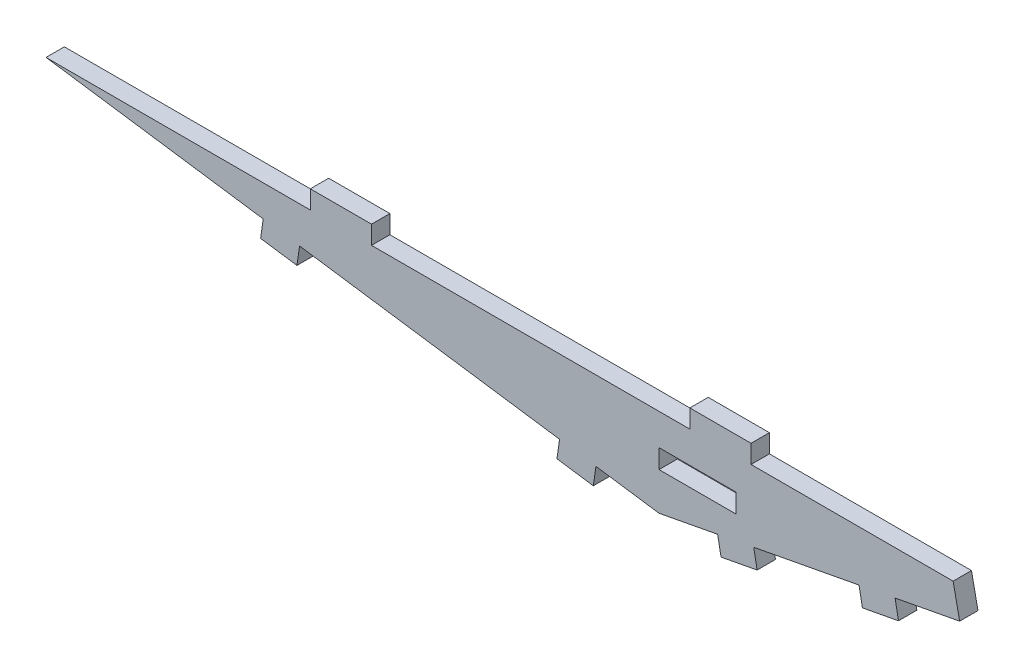
ISO-10303-21;
HEADER;
FILE_DESCRIPTION(('STEP AP214'),'2;1');
FILE_NAME('part.step','',(''),(''),'','','');
FILE_SCHEMA(('AUTOMOTIVE_DESIGN { 1 0 10303 214 1 1 1 1 }'));
ENDSEC;
DATA;
#1=APPLICATION_CONTEXT('core data for automotive mechanical design processes');
#2=APPLICATION_PROTOCOL_DEFINITION('international standard','automotive_design',2000,#1);
#3=PRODUCT_CONTEXT('',#1,'mechanical');
#4=PRODUCT('Part','Part','',(#3));
#5=PRODUCT_RELATED_PRODUCT_CATEGORY('part','',(#4));
#6=PRODUCT_DEFINITION_FORMATION('','',#4);
#7=PRODUCT_DEFINITION_CONTEXT('part definition',#1,'design');
#8=PRODUCT_DEFINITION('design','',#6,#7);
#9=PRODUCT_DEFINITION_SHAPE('','',#8);
#10=(LENGTH_UNIT() NAMED_UNIT(*) SI_UNIT(.MILLI.,.METRE.));
#11=(NAMED_UNIT(*) PLANE_ANGLE_UNIT() SI_UNIT($,.RADIAN.));
#12=(NAMED_UNIT(*) SI_UNIT($,.STERADIAN.) SOLID_ANGLE_UNIT());
#13=UNCERTAINTY_MEASURE_WITH_UNIT(LENGTH_MEASURE(1.E-05),#10,'distance_accuracy_value','');
#14=(GEOMETRIC_REPRESENTATION_CONTEXT(3) GLOBAL_UNCERTAINTY_ASSIGNED_CONTEXT((#13)) GLOBAL_UNIT_ASSIGNED_CONTEXT((#10,
#11,#12)) REPRESENTATION_CONTEXT('',''));
#15=CARTESIAN_POINT('',(0.,0.,0.));
#16=DIRECTION('',(0.,0.,1.));
#17=DIRECTION('',(1.,0.,0.));
#18=AXIS2_PLACEMENT_3D('',#15,#16,#17);
#19=CARTESIAN_POINT('',(-23.403233798281,-4.13319801123004,-1.524));
#20=DIRECTION('',(0.979200968562608,0.202892738081111,0.));
#21=DIRECTION('',(-0.202892738081111,0.979200968562608,0.));
#22=AXIS2_PLACEMENT_3D('',#19,#20,#21);
#23=PLANE('',#22);
#24=DIRECTION('',(-0.202892738081111,0.979200968562608,0.));
#25=VECTOR('',#24,1.);
#26=CARTESIAN_POINT('',(-23.403233798281,-4.13319801123004,0.));
#27=LINE('',#26,#25);
#28=CARTESIAN_POINT('',(-23.403233798281,-4.13319801123004,0.));
#29=VERTEX_POINT('',#28);
#30=CARTESIAN_POINT('',(-23.9438657478912,-1.52400000000021,0.));
#31=VERTEX_POINT('',#30);
#32=EDGE_CURVE('E278',#29,#31,#27,.T.);
#33=ORIENTED_EDGE('',*,*,#32,.F.);
#34=DIRECTION('',(0.,0.,1.));
#35=VECTOR('',#34,1.);
#36=CARTESIAN_POINT('',(-23.403233798281,-4.13319801123004,-1.524));
#37=LINE('',#36,#35);
#38=CARTESIAN_POINT('',(-23.403233798281,-4.13319801123004,-1.524));
#39=VERTEX_POINT('',#38);
#40=EDGE_CURVE('E11',#39,#29,#37,.T.);
#41=ORIENTED_EDGE('',*,*,#40,.F.);
#42=DIRECTION('',(-0.202892738081111,0.979200968562608,0.));
#43=VECTOR('',#42,1.);
#44=CARTESIAN_POINT('',(-23.403233798281,-4.13319801123004,-1.524));
#45=LINE('',#44,#43);
#46=CARTESIAN_POINT('',(-23.9438657478912,-1.52400000000021,-1.524));
#47=VERTEX_POINT('',#46);
#48=EDGE_CURVE('E282',#39,#47,#45,.T.);
#49=ORIENTED_EDGE('',*,*,#48,.T.);
#50=DIRECTION('',(0.,0.,1.));
#51=VECTOR('',#50,1.);
#52=CARTESIAN_POINT('',(-23.9438657478912,-1.52400000000021,-1.524));
#53=LINE('',#52,#51);
#54=EDGE_CURVE('E39',#47,#31,#53,.T.);
#55=ORIENTED_EDGE('',*,*,#54,.T.);
#56=EDGE_LOOP('',(#33,#41,#49,#55));
#57=FACE_BOUND('',#56,.T.);
#58=ADVANCED_FACE('F36',(#57),#23,.T.);
#59=CARTESIAN_POINT('',(-23.403233798281,-4.13319801123004,-1.524));
#60=DIRECTION('',(0.185772423247239,-0.982592798040393,0.));
#61=DIRECTION('',(0.982592798040393,0.185772423247239,0.));
#62=AXIS2_PLACEMENT_3D('',#59,#60,#61);
#63=PLANE('',#62);
#64=DIRECTION('',(0.982592798040393,0.185772423247239,0.));
#65=VECTOR('',#64,1.);
#66=CARTESIAN_POINT('',(-23.403233798281,-4.13319801123004,0.));
#67=LINE('',#66,#65);
#68=CARTESIAN_POINT('',(-28.7616153644906,-5.14627232871265,0.));
#69=VERTEX_POINT('',#68);
#70=EDGE_CURVE('E286',#69,#29,#67,.T.);
#71=ORIENTED_EDGE('',*,*,#70,.F.);
#72=DIRECTION('',(0.,0.,1.));
#73=VECTOR('',#72,1.);
#74=CARTESIAN_POINT('',(-28.7616153644906,-5.14627232871265,-1.524));
#75=LINE('',#74,#73);
#76=CARTESIAN_POINT('',(-28.7616153644906,-5.14627232871265,-1.524));
#77=VERTEX_POINT('',#76);
#78=EDGE_CURVE('E44',#77,#69,#75,.T.);
#79=ORIENTED_EDGE('',*,*,#78,.F.);
#80=DIRECTION('',(0.982592798040393,0.185772423247239,0.));
#81=VECTOR('',#80,1.);
#82=CARTESIAN_POINT('',(-23.403233798281,-4.13319801123004,-1.524));
#83=LINE('',#82,#81);
#84=EDGE_CURVE('E364',#77,#39,#83,.T.);
#85=ORIENTED_EDGE('',*,*,#84,.T.);
#86=ORIENTED_EDGE('',*,*,#40,.T.);
#87=EDGE_LOOP('',(#71,#79,#85,#86));
#88=FACE_BOUND('',#87,.T.);
#89=ADVANCED_FACE('F511',(#88),#63,.T.);
#90=CARTESIAN_POINT('',(-28.7616153644906,-5.14627232871265,-1.524));
#91=DIRECTION('',(0.982592798040394,0.185772423247235,0.));
#92=DIRECTION('',(-0.185772423247235,0.982592798040394,0.));
#93=AXIS2_PLACEMENT_3D('',#90,#91,#92);
#94=PLANE('',#93);
#95=DIRECTION('',(-0.185772423247235,0.982592798040394,0.));
#96=VECTOR('',#95,1.);
#97=CARTESIAN_POINT('',(-28.7616153644906,-5.14627232871265,0.));
#98=LINE('',#97,#96);
#99=CARTESIAN_POINT('',(-28.4784981914618,-6.64374375292641,0.));
#100=VERTEX_POINT('',#99);
#101=EDGE_CURVE('E444',#100,#69,#98,.T.);
#102=ORIENTED_EDGE('',*,*,#101,.F.);
#103=DIRECTION('',(0.,0.,1.));
#104=VECTOR('',#103,1.);
#105=CARTESIAN_POINT('',(-28.4784981914618,-6.64374375292641,-1.524));
#106=LINE('',#105,#104);
#107=CARTESIAN_POINT('',(-28.4784981914618,-6.64374375292641,-1.524));
#108=VERTEX_POINT('',#107);
#109=EDGE_CURVE('E450',#108,#100,#106,.T.);
#110=ORIENTED_EDGE('',*,*,#109,.F.);
#111=DIRECTION('',(-0.185772423247235,0.982592798040394,0.));
#112=VECTOR('',#111,1.);
#113=CARTESIAN_POINT('',(-28.7616153644906,-5.14627232871265,-1.524));
#114=LINE('',#113,#112);
#115=EDGE_CURVE('E361',#108,#77,#114,.T.);
#116=ORIENTED_EDGE('',*,*,#115,.T.);
#117=ORIENTED_EDGE('',*,*,#78,.T.);
#118=EDGE_LOOP('',(#102,#110,#116,#117));
#119=FACE_BOUND('',#118,.T.);
#120=ADVANCED_FACE('F610',(#119),#94,.T.);
#121=CARTESIAN_POINT('',(-31.4734410398889,-7.20997809898394,-1.524));
#122=DIRECTION('',(0.185772423247223,-0.982592798040396,0.));
#123=DIRECTION('',(0.982592798040396,0.185772423247223,0.));
#124=AXIS2_PLACEMENT_3D('',#121,#122,#123);
#125=PLANE('',#124);
#126=DIRECTION('',(0.982592798040396,0.185772423247223,0.));
#127=VECTOR('',#126,1.);
#128=CARTESIAN_POINT('',(-31.4734410398889,-7.20997809898394,0.));
#129=LINE('',#128,#127);
#130=CARTESIAN_POINT('',(-31.4734410398889,-7.20997809898394,0.));
#131=VERTEX_POINT('',#130);
#132=EDGE_CURVE('E441',#131,#100,#129,.T.);
#133=ORIENTED_EDGE('',*,*,#132,.F.);
#134=DIRECTION('',(0.,0.,1.));
#135=VECTOR('',#134,1.);
#136=CARTESIAN_POINT('',(-31.4734410398889,-7.20997809898394,-1.524));
#137=LINE('',#136,#135);
#138=CARTESIAN_POINT('',(-31.4734410398889,-7.20997809898394,-1.524));
#139=VERTEX_POINT('',#138);
#140=EDGE_CURVE('E452',#139,#131,#137,.T.);
#141=ORIENTED_EDGE('',*,*,#140,.F.);
#142=DIRECTION('',(0.982592798040396,0.185772423247223,0.));
#143=VECTOR('',#142,1.);
#144=CARTESIAN_POINT('',(-31.4734410398889,-7.20997809898394,-1.524));
#145=LINE('',#144,#143);
#146=EDGE_CURVE('E358',#139,#108,#145,.T.);
#147=ORIENTED_EDGE('',*,*,#146,.T.);
#148=ORIENTED_EDGE('',*,*,#109,.T.);
#149=EDGE_LOOP('',(#133,#141,#147,#148));
#150=FACE_BOUND('',#149,.T.);
#151=ADVANCED_FACE('F608',(#150),#125,.T.);
#152=CARTESIAN_POINT('',(-31.7565582129177,-5.71250667477038,-1.524));
#153=DIRECTION('',(-0.982592798040396,-0.185772423247221,0.));
#154=DIRECTION('',(0.185772423247221,-0.982592798040396,0.));
#155=AXIS2_PLACEMENT_3D('',#152,#153,#154);
#156=PLANE('',#155);
#157=DIRECTION('',(0.185772423247221,-0.982592798040397,0.));
#158=VECTOR('',#157,1.);
#159=CARTESIAN_POINT('',(-31.7565582129177,-5.71250667477038,0.));
#160=LINE('',#159,#158);
#161=CARTESIAN_POINT('',(-31.7565582129177,-5.71250667477038,0.));
#162=VERTEX_POINT('',#161);
#163=EDGE_CURVE('E438',#162,#131,#160,.T.);
#164=ORIENTED_EDGE('',*,*,#163,.F.);
#165=DIRECTION('',(0.,0.,1.));
#166=VECTOR('',#165,1.);
#167=CARTESIAN_POINT('',(-31.7565582129177,-5.71250667477038,-1.524));
#168=LINE('',#167,#166);
#169=CARTESIAN_POINT('',(-31.7565582129177,-5.71250667477038,-1.524));
#170=VERTEX_POINT('',#169);
#171=EDGE_CURVE('E454',#170,#162,#168,.T.);
#172=ORIENTED_EDGE('',*,*,#171,.F.);
#173=DIRECTION('',(0.185772423247221,-0.982592798040397,0.));
#174=VECTOR('',#173,1.);
#175=CARTESIAN_POINT('',(-31.7565582129177,-5.71250667477038,-1.524));
#176=LINE('',#175,#174);
#177=EDGE_CURVE('E355',#170,#139,#176,.T.);
#178=ORIENTED_EDGE('',*,*,#177,.T.);
#179=ORIENTED_EDGE('',*,*,#140,.T.);
#180=EDGE_LOOP('',(#164,#172,#178,#179));
#181=FACE_BOUND('',#180,.T.);
#182=ADVANCED_FACE('F604',(#181),#156,.T.);
#183=CARTESIAN_POINT('',(-31.7565582129177,-5.71250667477038,-1.524));
#184=DIRECTION('',(0.185772423247224,-0.982592798040396,0.));
#185=DIRECTION('',(0.982592798040396,0.185772423247224,0.));
#186=AXIS2_PLACEMENT_3D('',#183,#184,#185);
#187=PLANE('',#186);
#188=DIRECTION('',(0.982592798040396,0.185772423247224,0.));
#189=VECTOR('',#188,1.);
#190=CARTESIAN_POINT('',(-31.7565582129177,-5.71250667477038,0.));
#191=LINE('',#190,#189);
#192=CARTESIAN_POINT('',(-40.4952942076748,-7.36468259657784,0.));
#193=VERTEX_POINT('',#192);
#194=EDGE_CURVE('E435',#193,#162,#191,.T.);
#195=ORIENTED_EDGE('',*,*,#194,.F.);
#196=DIRECTION('',(0.,0.,1.));
#197=VECTOR('',#196,1.);
#198=CARTESIAN_POINT('',(-40.4952942076748,-7.36468259657784,-1.524));
#199=LINE('',#198,#197);
#200=CARTESIAN_POINT('',(-40.4952942076748,-7.36468259657784,-1.524));
#201=VERTEX_POINT('',#200);
#202=EDGE_CURVE('E456',#201,#193,#199,.T.);
#203=ORIENTED_EDGE('',*,*,#202,.F.);
#204=DIRECTION('',(0.982592798040396,0.185772423247224,0.));
#205=VECTOR('',#204,1.);
#206=CARTESIAN_POINT('',(-31.7565582129177,-5.71250667477038,-1.524));
#207=LINE('',#206,#205);
#208=EDGE_CURVE('E352',#201,#170,#207,.T.);
#209=ORIENTED_EDGE('',*,*,#208,.T.);
#210=ORIENTED_EDGE('',*,*,#171,.T.);
#211=EDGE_LOOP('',(#195,#203,#209,#210));
#212=FACE_BOUND('',#211,.T.);
#213=ADVANCED_FACE('F600',(#212),#187,.T.);
#214=CARTESIAN_POINT('',(-40.4952942076748,-7.36468259657784,-1.524));
#215=DIRECTION('',(0.982592798040396,0.185772423247225,0.));
#216=DIRECTION('',(-0.185772423247225,0.982592798040396,0.));
#217=AXIS2_PLACEMENT_3D('',#214,#215,#216);
#218=PLANE('',#217);
#219=DIRECTION('',(-0.185772423247225,0.982592798040396,0.));
#220=VECTOR('',#219,1.);
#221=CARTESIAN_POINT('',(-40.4952942076748,-7.36468259657784,0.));
#222=LINE('',#221,#220);
#223=CARTESIAN_POINT('',(-40.212177034646,-8.8621540207914,0.));
#224=VERTEX_POINT('',#223);
#225=EDGE_CURVE('E432',#224,#193,#222,.T.);
#226=ORIENTED_EDGE('',*,*,#225,.F.);
#227=DIRECTION('',(0.,0.,1.));
#228=VECTOR('',#227,1.);
#229=CARTESIAN_POINT('',(-40.212177034646,-8.8621540207914,-1.524));
#230=LINE('',#229,#228);
#231=CARTESIAN_POINT('',(-40.212177034646,-8.8621540207914,-1.524));
#232=VERTEX_POINT('',#231);
#233=EDGE_CURVE('E458',#232,#224,#230,.T.);
#234=ORIENTED_EDGE('',*,*,#233,.F.);
#235=DIRECTION('',(-0.185772423247225,0.982592798040396,0.));
#236=VECTOR('',#235,1.);
#237=CARTESIAN_POINT('',(-40.4952942076748,-7.36468259657784,-1.524));
#238=LINE('',#237,#236);
#239=EDGE_CURVE('E349',#232,#201,#238,.T.);
#240=ORIENTED_EDGE('',*,*,#239,.T.);
#241=ORIENTED_EDGE('',*,*,#202,.T.);
#242=EDGE_LOOP('',(#226,#234,#240,#241));
#243=FACE_BOUND('',#242,.T.);
#244=ADVANCED_FACE('F596',(#243),#218,.T.);
#245=CARTESIAN_POINT('',(-43.2071198830731,-9.42838836684895,-1.524));
#246=DIRECTION('',(0.185772423247225,-0.982592798040396,0.));
#247=DIRECTION('',(0.982592798040396,0.185772423247225,0.));
#248=AXIS2_PLACEMENT_3D('',#245,#246,#247);
#249=PLANE('',#248);
#250=DIRECTION('',(0.982592798040396,0.185772423247225,0.));
#251=VECTOR('',#250,1.);
#252=CARTESIAN_POINT('',(-43.2071198830731,-9.42838836684895,0.));
#253=LINE('',#252,#251);
#254=CARTESIAN_POINT('',(-43.2071198830731,-9.42838836684895,0.));
#255=VERTEX_POINT('',#254);
#256=EDGE_CURVE('E429',#255,#224,#253,.T.);
#257=ORIENTED_EDGE('',*,*,#256,.F.);
#258=DIRECTION('',(0.,0.,1.));
#259=VECTOR('',#258,1.);
#260=CARTESIAN_POINT('',(-43.2071198830731,-9.42838836684895,-1.524));
#261=LINE('',#260,#259);
#262=CARTESIAN_POINT('',(-43.2071198830731,-9.42838836684895,-1.524));
#263=VERTEX_POINT('',#262);
#264=EDGE_CURVE('E460',#263,#255,#261,.T.);
#265=ORIENTED_EDGE('',*,*,#264,.F.);
#266=DIRECTION('',(0.982592798040396,0.185772423247225,0.));
#267=VECTOR('',#266,1.);
#268=CARTESIAN_POINT('',(-43.2071198830731,-9.42838836684895,-1.524));
#269=LINE('',#268,#267);
#270=EDGE_CURVE('E346',#263,#232,#269,.T.);
#271=ORIENTED_EDGE('',*,*,#270,.T.);
#272=ORIENTED_EDGE('',*,*,#233,.T.);
#273=EDGE_LOOP('',(#257,#265,#271,#272));
#274=FACE_BOUND('',#273,.T.);
#275=ADVANCED_FACE('F592',(#274),#249,.T.);
#276=CARTESIAN_POINT('',(-43.4902370561019,-7.93091694263538,-1.524));
#277=DIRECTION('',(-0.982592798040396,-0.185772423247225,0.));
#278=DIRECTION('',(0.185772423247225,-0.982592798040396,0.));
#279=AXIS2_PLACEMENT_3D('',#276,#277,#278);
#280=PLANE('',#279);
#281=DIRECTION('',(0.185772423247225,-0.982592798040396,0.));
#282=VECTOR('',#281,1.);
#283=CARTESIAN_POINT('',(-43.4902370561019,-7.93091694263538,0.));
#284=LINE('',#283,#282);
#285=CARTESIAN_POINT('',(-43.4902370561019,-7.93091694263538,0.));
#286=VERTEX_POINT('',#285);
#287=EDGE_CURVE('E426',#286,#255,#284,.T.);
#288=ORIENTED_EDGE('',*,*,#287,.F.);
#289=DIRECTION('',(0.,0.,1.));
#290=VECTOR('',#289,1.);
#291=CARTESIAN_POINT('',(-43.4902370561019,-7.93091694263538,-1.524));
#292=LINE('',#291,#290);
#293=CARTESIAN_POINT('',(-43.4902370561019,-7.93091694263538,-1.524));
#294=VERTEX_POINT('',#293);
#295=EDGE_CURVE('E462',#294,#286,#292,.T.);
#296=ORIENTED_EDGE('',*,*,#295,.F.);
#297=DIRECTION('',(0.185772423247225,-0.982592798040396,0.));
#298=VECTOR('',#297,1.);
#299=CARTESIAN_POINT('',(-43.4902370561019,-7.93091694263538,-1.524));
#300=LINE('',#299,#298);
#301=EDGE_CURVE('E343',#294,#263,#300,.T.);
#302=ORIENTED_EDGE('',*,*,#301,.T.);
#303=ORIENTED_EDGE('',*,*,#264,.T.);
#304=EDGE_LOOP('',(#288,#296,#302,#303));
#305=FACE_BOUND('',#304,.T.);
#306=ADVANCED_FACE('F588',(#305),#280,.T.);
#307=CARTESIAN_POINT('',(-43.4902370561019,-7.93091694263538,-1.524));
#308=DIRECTION('',(0.185772423247235,-0.982592798040394,0.));
#309=DIRECTION('',(0.982592798040394,0.185772423247235,0.));
#310=AXIS2_PLACEMENT_3D('',#307,#308,#309);
#311=PLANE('',#310);
#312=DIRECTION('',(0.982592798040394,0.185772423247235,0.));
#313=VECTOR('',#312,1.);
#314=CARTESIAN_POINT('',(-43.4902370561019,-7.93091694263538,0.));
#315=LINE('',#314,#313);
#316=CARTESIAN_POINT('',(-48.3559852926869,-8.85085228372894,0.));
#317=VERTEX_POINT('',#316);
#318=EDGE_CURVE('E423',#317,#286,#315,.T.);
#319=ORIENTED_EDGE('',*,*,#318,.F.);
#320=DIRECTION('',(0.,0.,1.));
#321=VECTOR('',#320,1.);
#322=CARTESIAN_POINT('',(-48.3559852926869,-8.85085228372894,-1.524));
#323=LINE('',#322,#321);
#324=CARTESIAN_POINT('',(-48.3559852926869,-8.85085228372894,-1.524));
#325=VERTEX_POINT('',#324);
#326=EDGE_CURVE('E464',#325,#317,#323,.T.);
#327=ORIENTED_EDGE('',*,*,#326,.F.);
#328=DIRECTION('',(0.982592798040394,0.185772423247235,0.));
#329=VECTOR('',#328,1.);
#330=CARTESIAN_POINT('',(-43.4902370561019,-7.93091694263538,-1.524));
#331=LINE('',#330,#329);
#332=EDGE_CURVE('E340',#325,#294,#331,.T.);
#333=ORIENTED_EDGE('',*,*,#332,.T.);
#334=ORIENTED_EDGE('',*,*,#295,.T.);
#335=EDGE_LOOP('',(#319,#327,#333,#334));
#336=FACE_BOUND('',#335,.T.);
#337=ADVANCED_FACE('F584',(#336),#311,.T.);
#338=CARTESIAN_POINT('',(-48.3559852926869,-8.85085228372894,-1.524));
#339=DIRECTION('',(-0.142523711830452,-0.989791387902557,0.));
#340=DIRECTION('',(0.989791387902557,-0.142523711830452,0.));
#341=AXIS2_PLACEMENT_3D('',#338,#339,#340);
#342=PLANE('',#341);
#343=DIRECTION('',(0.989791387902557,-0.142523711830452,0.));
#344=VECTOR('',#343,1.);
#345=CARTESIAN_POINT('',(-48.3559852926869,-8.85085228372894,0.));
#346=LINE('',#345,#344);
#347=CARTESIAN_POINT('',(-53.5933554469955,-8.09670404224559,0.));
#348=VERTEX_POINT('',#347);
#349=EDGE_CURVE('E420',#348,#317,#346,.T.);
#350=ORIENTED_EDGE('',*,*,#349,.F.);
#351=DIRECTION('',(0.,0.,1.));
#352=VECTOR('',#351,1.);
#353=CARTESIAN_POINT('',(-53.5933554469955,-8.09670404224559,-1.524));
#354=LINE('',#353,#352);
#355=CARTESIAN_POINT('',(-53.5933554469955,-8.09670404224559,-1.524));
#356=VERTEX_POINT('',#355);
#357=EDGE_CURVE('E466',#356,#348,#354,.T.);
#358=ORIENTED_EDGE('',*,*,#357,.F.);
#359=DIRECTION('',(0.989791387902557,-0.142523711830452,0.));
#360=VECTOR('',#359,1.);
#361=CARTESIAN_POINT('',(-48.3559852926869,-8.85085228372894,-1.524));
#362=LINE('',#361,#360);
#363=EDGE_CURVE('E337',#356,#325,#362,.T.);
#364=ORIENTED_EDGE('',*,*,#363,.T.);
#365=ORIENTED_EDGE('',*,*,#326,.T.);
#366=EDGE_LOOP('',(#350,#358,#364,#365));
#367=FACE_BOUND('',#366,.T.);
#368=ADVANCED_FACE('F580',(#367),#342,.T.);
#369=CARTESIAN_POINT('',(-53.5933554469955,-8.09670404224559,-1.524));
#370=DIRECTION('',(0.989791387902557,-0.142523711830451,0.));
#371=DIRECTION('',(0.142523711830451,0.989791387902557,0.));
#372=AXIS2_PLACEMENT_3D('',#369,#370,#371);
#373=PLANE('',#372);
#374=DIRECTION('',(0.142523711830451,0.989791387902557,0.));
#375=VECTOR('',#374,1.);
#376=CARTESIAN_POINT('',(-53.5933554469955,-8.09670404224559,0.));
#377=LINE('',#376,#375);
#378=CARTESIAN_POINT('',(-53.8105615838251,-9.60514611740908,0.));
#379=VERTEX_POINT('',#378);
#380=EDGE_CURVE('E417',#379,#348,#377,.T.);
#381=ORIENTED_EDGE('',*,*,#380,.F.);
#382=DIRECTION('',(0.,0.,1.));
#383=VECTOR('',#382,1.);
#384=CARTESIAN_POINT('',(-53.8105615838251,-9.60514611740908,-1.524));
#385=LINE('',#384,#383);
#386=CARTESIAN_POINT('',(-53.8105615838251,-9.60514611740908,-1.524));
#387=VERTEX_POINT('',#386);
#388=EDGE_CURVE('E468',#387,#379,#385,.T.);
#389=ORIENTED_EDGE('',*,*,#388,.F.);
#390=DIRECTION('',(0.142523711830451,0.989791387902557,0.));
#391=VECTOR('',#390,1.);
#392=CARTESIAN_POINT('',(-53.5933554469955,-8.09670404224559,-1.524));
#393=LINE('',#392,#391);
#394=EDGE_CURVE('E334',#387,#356,#393,.T.);
#395=ORIENTED_EDGE('',*,*,#394,.T.);
#396=ORIENTED_EDGE('',*,*,#357,.T.);
#397=EDGE_LOOP('',(#381,#389,#395,#396));
#398=FACE_BOUND('',#397,.T.);
#399=ADVANCED_FACE('F576',(#398),#373,.T.);
#400=CARTESIAN_POINT('',(-56.8274457341521,-9.17073384374987,-1.524));
#401=DIRECTION('',(-0.142523711830451,-0.989791387902557,0.));
#402=DIRECTION('',(0.989791387902557,-0.142523711830451,0.));
#403=AXIS2_PLACEMENT_3D('',#400,#401,#402);
#404=PLANE('',#403);
#405=DIRECTION('',(0.989791387902557,-0.142523711830451,0.));
#406=VECTOR('',#405,1.);
#407=CARTESIAN_POINT('',(-56.8274457341521,-9.17073384374987,0.));
#408=LINE('',#407,#406);
#409=CARTESIAN_POINT('',(-56.8274457341521,-9.17073384374987,0.));
#410=VERTEX_POINT('',#409);
#411=EDGE_CURVE('E414',#410,#379,#408,.T.);
#412=ORIENTED_EDGE('',*,*,#411,.F.);
#413=DIRECTION('',(0.,0.,1.));
#414=VECTOR('',#413,1.);
#415=CARTESIAN_POINT('',(-56.8274457341521,-9.17073384374987,-1.524));
#416=LINE('',#415,#414);
#417=CARTESIAN_POINT('',(-56.8274457341521,-9.17073384374987,-1.524));
#418=VERTEX_POINT('',#417);
#419=EDGE_CURVE('E470',#418,#410,#416,.T.);
#420=ORIENTED_EDGE('',*,*,#419,.F.);
#421=DIRECTION('',(0.989791387902557,-0.142523711830451,0.));
#422=VECTOR('',#421,1.);
#423=CARTESIAN_POINT('',(-56.8274457341521,-9.17073384374987,-1.524));
#424=LINE('',#423,#422);
#425=EDGE_CURVE('E331',#418,#387,#424,.T.);
#426=ORIENTED_EDGE('',*,*,#425,.T.);
#427=ORIENTED_EDGE('',*,*,#388,.T.);
#428=EDGE_LOOP('',(#412,#420,#426,#427));
#429=FACE_BOUND('',#428,.T.);
#430=ADVANCED_FACE('F572',(#429),#404,.T.);
#431=CARTESIAN_POINT('',(-56.6102395973225,-7.66229176858637,-1.524));
#432=DIRECTION('',(-0.989791387902557,0.142523711830451,0.));
#433=DIRECTION('',(-0.142523711830451,-0.989791387902557,0.));
#434=AXIS2_PLACEMENT_3D('',#431,#432,#433);
#435=PLANE('',#434);
#436=DIRECTION('',(-0.142523711830451,-0.989791387902557,0.));
#437=VECTOR('',#436,1.);
#438=CARTESIAN_POINT('',(-56.6102395973225,-7.66229176858637,0.));
#439=LINE('',#438,#437);
#440=CARTESIAN_POINT('',(-56.6102395973225,-7.66229176858637,0.));
#441=VERTEX_POINT('',#440);
#442=EDGE_CURVE('E411',#441,#410,#439,.T.);
#443=ORIENTED_EDGE('',*,*,#442,.F.);
#444=DIRECTION('',(0.,0.,1.));
#445=VECTOR('',#444,1.);
#446=CARTESIAN_POINT('',(-56.6102395973225,-7.66229176858637,-1.524));
#447=LINE('',#446,#445);
#448=CARTESIAN_POINT('',(-56.6102395973225,-7.66229176858637,-1.524));
#449=VERTEX_POINT('',#448);
#450=EDGE_CURVE('E472',#449,#441,#447,.T.);
#451=ORIENTED_EDGE('',*,*,#450,.F.);
#452=DIRECTION('',(-0.142523711830451,-0.989791387902557,0.));
#453=VECTOR('',#452,1.);
#454=CARTESIAN_POINT('',(-56.6102395973225,-7.66229176858637,-1.524));
#455=LINE('',#454,#453);
#456=EDGE_CURVE('E328',#449,#418,#455,.T.);
#457=ORIENTED_EDGE('',*,*,#456,.T.);
#458=ORIENTED_EDGE('',*,*,#419,.T.);
#459=EDGE_LOOP('',(#443,#451,#457,#458));
#460=FACE_BOUND('',#459,.T.);
#461=ADVANCED_FACE('F568',(#460),#435,.T.);
#462=CARTESIAN_POINT('',(-56.6102395973225,-7.66229176858637,-1.524));
#463=DIRECTION('',(-0.142523711830451,-0.989791387902557,0.));
#464=DIRECTION('',(0.989791387902557,-0.142523711830451,0.));
#465=AXIS2_PLACEMENT_3D('',#462,#463,#464);
#466=PLANE('',#465);
#467=DIRECTION('',(0.989791387902557,-0.142523711830451,0.));
#468=VECTOR('',#467,1.);
#469=CARTESIAN_POINT('',(-56.6102395973225,-7.66229176858637,0.));
#470=LINE('',#469,#468);
#471=CARTESIAN_POINT('',(-78.19192672128,-4.55466505646883,0.));
#472=VERTEX_POINT('',#471);
#473=EDGE_CURVE('E408',#472,#441,#470,.T.);
#474=ORIENTED_EDGE('',*,*,#473,.F.);
#475=DIRECTION('',(0.,0.,1.));
#476=VECTOR('',#475,1.);
#477=CARTESIAN_POINT('',(-78.19192672128,-4.55466505646883,-1.524));
#478=LINE('',#477,#476);
#479=CARTESIAN_POINT('',(-78.19192672128,-4.55466505646883,-1.524));
#480=VERTEX_POINT('',#479);
#481=EDGE_CURVE('E474',#480,#472,#478,.T.);
#482=ORIENTED_EDGE('',*,*,#481,.F.);
#483=DIRECTION('',(0.989791387902557,-0.142523711830451,0.));
#484=VECTOR('',#483,1.);
#485=CARTESIAN_POINT('',(-56.6102395973225,-7.66229176858637,-1.524));
#486=LINE('',#485,#484);
#487=EDGE_CURVE('E325',#480,#449,#486,.T.);
#488=ORIENTED_EDGE('',*,*,#487,.T.);
#489=ORIENTED_EDGE('',*,*,#450,.T.);
#490=EDGE_LOOP('',(#474,#482,#488,#489));
#491=FACE_BOUND('',#490,.T.);
#492=ADVANCED_FACE('F564',(#491),#466,.T.);
#493=CARTESIAN_POINT('',(-78.19192672128,-4.55466505646883,-1.524));
#494=DIRECTION('',(0.989791387902558,-0.142523711830447,0.));
#495=DIRECTION('',(0.142523711830447,0.989791387902558,0.));
#496=AXIS2_PLACEMENT_3D('',#493,#494,#495);
#497=PLANE('',#496);
#498=DIRECTION('',(0.142523711830447,0.989791387902558,0.));
#499=VECTOR('',#498,1.);
#500=CARTESIAN_POINT('',(-78.19192672128,-4.55466505646883,0.));
#501=LINE('',#500,#499);
#502=CARTESIAN_POINT('',(-78.4091328581096,-6.06310713163233,0.));
#503=VERTEX_POINT('',#502);
#504=EDGE_CURVE('E405',#503,#472,#501,.T.);
#505=ORIENTED_EDGE('',*,*,#504,.F.);
#506=DIRECTION('',(0.,0.,1.));
#507=VECTOR('',#506,1.);
#508=CARTESIAN_POINT('',(-78.4091328581096,-6.06310713163233,-1.524));
#509=LINE('',#508,#507);
#510=CARTESIAN_POINT('',(-78.4091328581096,-6.06310713163233,-1.524));
#511=VERTEX_POINT('',#510);
#512=EDGE_CURVE('E476',#511,#503,#509,.T.);
#513=ORIENTED_EDGE('',*,*,#512,.F.);
#514=DIRECTION('',(0.142523711830447,0.989791387902558,0.));
#515=VECTOR('',#514,1.);
#516=CARTESIAN_POINT('',(-78.19192672128,-4.55466505646883,-1.524));
#517=LINE('',#516,#515);
#518=EDGE_CURVE('E322',#511,#480,#517,.T.);
#519=ORIENTED_EDGE('',*,*,#518,.T.);
#520=ORIENTED_EDGE('',*,*,#481,.T.);
#521=EDGE_LOOP('',(#505,#513,#519,#520));
#522=FACE_BOUND('',#521,.T.);
#523=ADVANCED_FACE('F560',(#522),#497,.T.);
#524=CARTESIAN_POINT('',(-81.4260170084366,-5.62869485797311,-1.524));
#525=DIRECTION('',(-0.142523711830451,-0.989791387902557,0.));
#526=DIRECTION('',(0.989791387902557,-0.142523711830451,0.));
#527=AXIS2_PLACEMENT_3D('',#524,#525,#526);
#528=PLANE('',#527);
#529=DIRECTION('',(0.989791387902557,-0.142523711830451,0.));
#530=VECTOR('',#529,1.);
#531=CARTESIAN_POINT('',(-81.4260170084366,-5.62869485797311,0.));
#532=LINE('',#531,#530);
#533=CARTESIAN_POINT('',(-81.4260170084366,-5.62869485797311,0.));
#534=VERTEX_POINT('',#533);
#535=EDGE_CURVE('E402',#534,#503,#532,.T.);
#536=ORIENTED_EDGE('',*,*,#535,.F.);
#537=DIRECTION('',(0.,0.,1.));
#538=VECTOR('',#537,1.);
#539=CARTESIAN_POINT('',(-81.4260170084366,-5.62869485797311,-1.524));
#540=LINE('',#539,#538);
#541=CARTESIAN_POINT('',(-81.4260170084366,-5.62869485797311,-1.524));
#542=VERTEX_POINT('',#541);
#543=EDGE_CURVE('E478',#542,#534,#540,.T.);
#544=ORIENTED_EDGE('',*,*,#543,.F.);
#545=DIRECTION('',(0.989791387902557,-0.142523711830451,0.));
#546=VECTOR('',#545,1.);
#547=CARTESIAN_POINT('',(-81.4260170084366,-5.62869485797311,-1.524));
#548=LINE('',#547,#546);
#549=EDGE_CURVE('E319',#542,#511,#548,.T.);
#550=ORIENTED_EDGE('',*,*,#549,.T.);
#551=ORIENTED_EDGE('',*,*,#512,.T.);
#552=EDGE_LOOP('',(#536,#544,#550,#551));
#553=FACE_BOUND('',#552,.T.);
#554=ADVANCED_FACE('F556',(#553),#528,.T.);
#555=CARTESIAN_POINT('',(-81.208810871607,-4.12025278280962,-1.524));
#556=DIRECTION('',(-0.989791387902558,0.142523711830447,0.));
#557=DIRECTION('',(-0.142523711830447,-0.989791387902558,0.));
#558=AXIS2_PLACEMENT_3D('',#555,#556,#557);
#559=PLANE('',#558);
#560=DIRECTION('',(-0.142523711830447,-0.989791387902558,0.));
#561=VECTOR('',#560,1.);
#562=CARTESIAN_POINT('',(-81.208810871607,-4.12025278280962,0.));
#563=LINE('',#562,#561);
#564=CARTESIAN_POINT('',(-81.208810871607,-4.12025278280962,0.));
#565=VERTEX_POINT('',#564);
#566=EDGE_CURVE('E399',#565,#534,#563,.T.);
#567=ORIENTED_EDGE('',*,*,#566,.F.);
#568=DIRECTION('',(0.,0.,1.));
#569=VECTOR('',#568,1.);
#570=CARTESIAN_POINT('',(-81.208810871607,-4.12025278280962,-1.524));
#571=LINE('',#570,#569);
#572=CARTESIAN_POINT('',(-81.208810871607,-4.12025278280962,-1.524));
#573=VERTEX_POINT('',#572);
#574=EDGE_CURVE('E480',#573,#565,#571,.T.);
#575=ORIENTED_EDGE('',*,*,#574,.F.);
#576=DIRECTION('',(-0.142523711830447,-0.989791387902558,0.));
#577=VECTOR('',#576,1.);
#578=CARTESIAN_POINT('',(-81.208810871607,-4.12025278280962,-1.524));
#579=LINE('',#578,#577);
#580=EDGE_CURVE('E316',#573,#542,#579,.T.);
#581=ORIENTED_EDGE('',*,*,#580,.T.);
#582=ORIENTED_EDGE('',*,*,#543,.T.);
#583=EDGE_LOOP('',(#567,#575,#581,#582));
#584=FACE_BOUND('',#583,.T.);
#585=ADVANCED_FACE('F552',(#584),#559,.T.);
#586=CARTESIAN_POINT('',(-81.208810871607,-4.12025278280962,-1.524));
#587=DIRECTION('',(-0.142523711830451,-0.989791387902557,0.));
#588=DIRECTION('',(0.989791387902557,-0.142523711830451,0.));
#589=AXIS2_PLACEMENT_3D('',#586,#587,#588);
#590=PLANE('',#589);
#591=DIRECTION('',(0.989791387902557,-0.142523711830451,0.));
#592=VECTOR('',#591,1.);
#593=CARTESIAN_POINT('',(-81.208810871607,-4.12025278280962,0.));
#594=LINE('',#593,#592);
#595=CARTESIAN_POINT('',(-99.2391344734777,-1.52400000000022,0.));
#596=VERTEX_POINT('',#595);
#597=EDGE_CURVE('E396',#596,#565,#594,.T.);
#598=ORIENTED_EDGE('',*,*,#597,.F.);
#599=DIRECTION('',(0.,0.,1.));
#600=VECTOR('',#599,1.);
#601=CARTESIAN_POINT('',(-99.2391344734777,-1.52400000000022,-1.524));
#602=LINE('',#601,#600);
#603=CARTESIAN_POINT('',(-99.2391344734777,-1.52400000000022,-1.524));
#604=VERTEX_POINT('',#603);
#605=EDGE_CURVE('E482',#604,#596,#602,.T.);
#606=ORIENTED_EDGE('',*,*,#605,.F.);
#607=DIRECTION('',(0.989791387902557,-0.142523711830451,0.));
#608=VECTOR('',#607,1.);
#609=CARTESIAN_POINT('',(-81.208810871607,-4.12025278280962,-1.524));
#610=LINE('',#609,#608);
#611=EDGE_CURVE('E313',#604,#573,#610,.T.);
#612=ORIENTED_EDGE('',*,*,#611,.T.);
#613=ORIENTED_EDGE('',*,*,#574,.T.);
#614=EDGE_LOOP('',(#598,#606,#612,#613));
#615=FACE_BOUND('',#614,.T.);
#616=ADVANCED_FACE('F548',(#615),#590,.T.);
#617=CARTESIAN_POINT('',(-77.3001432809928,-1.52400000000021,-1.524));
#618=DIRECTION('',(0.,1.,0.));
#619=DIRECTION('',(-1.,0.,0.));
#620=AXIS2_PLACEMENT_3D('',#617,#618,#619);
#621=PLANE('',#620);
#622=DIRECTION('',(-1.,0.,0.));
#623=VECTOR('',#622,1.);
#624=CARTESIAN_POINT('',(-77.3001432809928,-1.52400000000021,0.));
#625=LINE('',#624,#623);
#626=CARTESIAN_POINT('',(-77.3001432809928,-1.52400000000021,0.));
#627=VERTEX_POINT('',#626);
#628=EDGE_CURVE('E393',#627,#596,#625,.T.);
#629=ORIENTED_EDGE('',*,*,#628,.F.);
#630=DIRECTION('',(0.,0.,1.));
#631=VECTOR('',#630,1.);
#632=CARTESIAN_POINT('',(-77.3001432809928,-1.52400000000021,-1.524));
#633=LINE('',#632,#631);
#634=CARTESIAN_POINT('',(-77.3001432809928,-1.52400000000021,-1.524));
#635=VERTEX_POINT('',#634);
#636=EDGE_CURVE('E484',#635,#627,#633,.T.);
#637=ORIENTED_EDGE('',*,*,#636,.F.);
#638=DIRECTION('',(-1.,0.,0.));
#639=VECTOR('',#638,1.);
#640=CARTESIAN_POINT('',(-77.3001432809928,-1.52400000000021,-1.524));
#641=LINE('',#640,#639);
#642=EDGE_CURVE('E310',#635,#604,#641,.T.);
#643=ORIENTED_EDGE('',*,*,#642,.T.);
#644=ORIENTED_EDGE('',*,*,#605,.T.);
#645=EDGE_LOOP('',(#629,#637,#643,#644));
#646=FACE_BOUND('',#645,.T.);
#647=ADVANCED_FACE('F544',(#646),#621,.T.);
#648=CARTESIAN_POINT('',(-77.3001432809928,-2.1163626406917E-13,-1.524));
#649=DIRECTION('',(-1.,0.,0.));
#650=DIRECTION('',(0.,0.,1.));
#651=AXIS2_PLACEMENT_3D('',#648,#649,#650);
#652=PLANE('',#651);
#653=DIRECTION('',(0.,-1.,0.));
#654=VECTOR('',#653,1.);
#655=CARTESIAN_POINT('',(-77.3001432809928,-2.1163626406917E-13,0.));
#656=LINE('',#655,#654);
#657=CARTESIAN_POINT('',(-77.3001432809928,-2.1163626406917E-13,0.));
#658=VERTEX_POINT('',#657);
#659=EDGE_CURVE('E390',#658,#627,#656,.T.);
#660=ORIENTED_EDGE('',*,*,#659,.F.);
#661=DIRECTION('',(0.,0.,1.));
#662=VECTOR('',#661,1.);
#663=CARTESIAN_POINT('',(-77.3001432809928,-2.1163626406917E-13,-1.524));
#664=LINE('',#663,#662);
#665=CARTESIAN_POINT('',(-77.3001432809928,-2.1163626406917E-13,-1.524));
#666=VERTEX_POINT('',#665);
#667=EDGE_CURVE('E486',#666,#658,#664,.T.);
#668=ORIENTED_EDGE('',*,*,#667,.F.);
#669=DIRECTION('',(0.,-1.,0.));
#670=VECTOR('',#669,1.);
#671=CARTESIAN_POINT('',(-77.3001432809928,-2.1163626406917E-13,-1.524));
#672=LINE('',#671,#670);
#673=EDGE_CURVE('E307',#666,#635,#672,.T.);
#674=ORIENTED_EDGE('',*,*,#673,.T.);
#675=ORIENTED_EDGE('',*,*,#636,.T.);
#676=EDGE_LOOP('',(#660,#668,#674,#675));
#677=FACE_BOUND('',#676,.T.);
#678=ADVANCED_FACE('F540',(#677),#652,.T.);
#679=CARTESIAN_POINT('',(-72.2201432809928,-2.1163626406917E-13,-1.524));
#680=DIRECTION('',(0.,1.,0.));
#681=DIRECTION('',(0.,0.,1.));
#682=AXIS2_PLACEMENT_3D('',#679,#680,#681);
#683=PLANE('',#682);
#684=DIRECTION('',(-1.,0.,0.));
#685=VECTOR('',#684,1.);
#686=CARTESIAN_POINT('',(-72.2201432809928,-2.1163626406917E-13,0.));
#687=LINE('',#686,#685);
#688=CARTESIAN_POINT('',(-72.2201432809928,-2.1163626406917E-13,0.));
#689=VERTEX_POINT('',#688);
#690=EDGE_CURVE('E387',#689,#658,#687,.T.);
#691=ORIENTED_EDGE('',*,*,#690,.F.);
#692=DIRECTION('',(0.,0.,1.));
#693=VECTOR('',#692,1.);
#694=CARTESIAN_POINT('',(-72.2201432809928,-2.1163626406917E-13,-1.524));
#695=LINE('',#694,#693);
#696=CARTESIAN_POINT('',(-72.2201432809928,-2.1163626406917E-13,-1.524));
#697=VERTEX_POINT('',#696);
#698=EDGE_CURVE('E488',#697,#689,#695,.T.);
#699=ORIENTED_EDGE('',*,*,#698,.F.);
#700=DIRECTION('',(-1.,0.,0.));
#701=VECTOR('',#700,1.);
#702=CARTESIAN_POINT('',(-72.2201432809928,-2.1163626406917E-13,-1.524));
#703=LINE('',#702,#701);
#704=EDGE_CURVE('E304',#697,#666,#703,.T.);
#705=ORIENTED_EDGE('',*,*,#704,.T.);
#706=ORIENTED_EDGE('',*,*,#667,.T.);
#707=EDGE_LOOP('',(#691,#699,#705,#706));
#708=FACE_BOUND('',#707,.T.);
#709=ADVANCED_FACE('F536',(#708),#683,.T.);
#710=CARTESIAN_POINT('',(-72.2201432809928,-1.52400000000021,-1.524));
#711=DIRECTION('',(1.,0.,0.));
#712=DIRECTION('',(0.,0.,-1.));
#713=AXIS2_PLACEMENT_3D('',#710,#711,#712);
#714=PLANE('',#713);
#715=DIRECTION('',(0.,1.,0.));
#716=VECTOR('',#715,1.);
#717=CARTESIAN_POINT('',(-72.2201432809928,-1.52400000000021,0.));
#718=LINE('',#717,#716);
#719=CARTESIAN_POINT('',(-72.2201432809928,-1.52400000000021,0.));
#720=VERTEX_POINT('',#719);
#721=EDGE_CURVE('E384',#720,#689,#718,.T.);
#722=ORIENTED_EDGE('',*,*,#721,.F.);
#723=DIRECTION('',(0.,0.,1.));
#724=VECTOR('',#723,1.);
#725=CARTESIAN_POINT('',(-72.2201432809928,-1.52400000000021,-1.524));
#726=LINE('',#725,#724);
#727=CARTESIAN_POINT('',(-72.2201432809928,-1.52400000000021,-1.524));
#728=VERTEX_POINT('',#727);
#729=EDGE_CURVE('E490',#728,#720,#726,.T.);
#730=ORIENTED_EDGE('',*,*,#729,.F.);
#731=DIRECTION('',(0.,1.,0.));
#732=VECTOR('',#731,1.);
#733=CARTESIAN_POINT('',(-72.2201432809928,-1.52400000000021,-1.524));
#734=LINE('',#733,#732);
#735=EDGE_CURVE('E301',#728,#697,#734,.T.);
#736=ORIENTED_EDGE('',*,*,#735,.T.);
#737=ORIENTED_EDGE('',*,*,#698,.T.);
#738=EDGE_LOOP('',(#722,#730,#736,#737));
#739=FACE_BOUND('',#738,.T.);
#740=ADVANCED_FACE('F532',(#739),#714,.T.);
#741=CARTESIAN_POINT('',(-45.7977000055466,-1.52400000000021,-1.524));
#742=DIRECTION('',(0.,1.,0.));
#743=DIRECTION('',(-1.,0.,0.));
#744=AXIS2_PLACEMENT_3D('',#741,#742,#743);
#745=PLANE('',#744);
#746=DIRECTION('',(-1.,0.,0.));
#747=VECTOR('',#746,1.);
#748=CARTESIAN_POINT('',(-45.7977000055466,-1.52400000000021,0.));
#749=LINE('',#748,#747);
#750=CARTESIAN_POINT('',(-45.7977000055466,-1.52400000000021,0.));
#751=VERTEX_POINT('',#750);
#752=EDGE_CURVE('E381',#751,#720,#749,.T.);
#753=ORIENTED_EDGE('',*,*,#752,.F.);
#754=DIRECTION('',(0.,0.,1.));
#755=VECTOR('',#754,1.);
#756=CARTESIAN_POINT('',(-45.7977000055466,-1.52400000000021,-1.524));
#757=LINE('',#756,#755);
#758=CARTESIAN_POINT('',(-45.7977000055466,-1.52400000000021,-1.524));
#759=VERTEX_POINT('',#758);
#760=EDGE_CURVE('E492',#759,#751,#757,.T.);
#761=ORIENTED_EDGE('',*,*,#760,.F.);
#762=DIRECTION('',(-1.,0.,0.));
#763=VECTOR('',#762,1.);
#764=CARTESIAN_POINT('',(-45.7977000055466,-1.52400000000021,-1.524));
#765=LINE('',#764,#763);
#766=EDGE_CURVE('E298',#759,#728,#765,.T.);
#767=ORIENTED_EDGE('',*,*,#766,.T.);
#768=ORIENTED_EDGE('',*,*,#729,.T.);
#769=EDGE_LOOP('',(#753,#761,#767,#768));
#770=FACE_BOUND('',#769,.T.);
#771=ADVANCED_FACE('F528',(#770),#745,.T.);
#772=CARTESIAN_POINT('',(-45.7977000055466,-2.1163626406917E-13,-1.524));
#773=DIRECTION('',(-1.,0.,0.));
#774=DIRECTION('',(0.,0.,1.));
#775=AXIS2_PLACEMENT_3D('',#772,#773,#774);
#776=PLANE('',#775);
#777=DIRECTION('',(0.,-1.,0.));
#778=VECTOR('',#777,1.);
#779=CARTESIAN_POINT('',(-45.7977000055466,-2.1163626406917E-13,0.));
#780=LINE('',#779,#778);
#781=CARTESIAN_POINT('',(-45.7977000055466,-2.1163626406917E-13,0.));
#782=VERTEX_POINT('',#781);
#783=EDGE_CURVE('E378',#782,#751,#780,.T.);
#784=ORIENTED_EDGE('',*,*,#783,.F.);
#785=DIRECTION('',(0.,0.,1.));
#786=VECTOR('',#785,1.);
#787=CARTESIAN_POINT('',(-45.7977000055466,-2.1163626406917E-13,-1.524));
#788=LINE('',#787,#786);
#789=CARTESIAN_POINT('',(-45.7977000055466,-2.1163626406917E-13,-1.524));
#790=VERTEX_POINT('',#789);
#791=EDGE_CURVE('E494',#790,#782,#788,.T.);
#792=ORIENTED_EDGE('',*,*,#791,.F.);
#793=DIRECTION('',(0.,-1.,0.));
#794=VECTOR('',#793,1.);
#795=CARTESIAN_POINT('',(-45.7977000055466,-2.1163626406917E-13,-1.524));
#796=LINE('',#795,#794);
#797=EDGE_CURVE('E295',#790,#759,#796,.T.);
#798=ORIENTED_EDGE('',*,*,#797,.T.);
#799=ORIENTED_EDGE('',*,*,#760,.T.);
#800=EDGE_LOOP('',(#784,#792,#798,#799));
#801=FACE_BOUND('',#800,.T.);
#802=ADVANCED_FACE('F524',(#801),#776,.T.);
#803=CARTESIAN_POINT('',(-40.7177000055466,-2.1163626406917E-13,-1.524));
#804=DIRECTION('',(0.,1.,0.));
#805=DIRECTION('',(0.,0.,1.));
#806=AXIS2_PLACEMENT_3D('',#803,#804,#805);
#807=PLANE('',#806);
#808=DIRECTION('',(-1.,0.,0.));
#809=VECTOR('',#808,1.);
#810=CARTESIAN_POINT('',(-40.7177000055466,-2.1163626406917E-13,0.));
#811=LINE('',#810,#809);
#812=CARTESIAN_POINT('',(-40.7177000055466,-2.1163626406917E-13,0.));
#813=VERTEX_POINT('',#812);
#814=EDGE_CURVE('E375',#813,#782,#811,.T.);
#815=ORIENTED_EDGE('',*,*,#814,.F.);
#816=DIRECTION('',(0.,0.,1.));
#817=VECTOR('',#816,1.);
#818=CARTESIAN_POINT('',(-40.7177000055466,-2.1163626406917E-13,-1.524));
#819=LINE('',#818,#817);
#820=CARTESIAN_POINT('',(-40.7177000055466,-2.1163626406917E-13,-1.524));
#821=VERTEX_POINT('',#820);
#822=EDGE_CURVE('E496',#821,#813,#819,.T.);
#823=ORIENTED_EDGE('',*,*,#822,.F.);
#824=DIRECTION('',(-1.,0.,0.));
#825=VECTOR('',#824,1.);
#826=CARTESIAN_POINT('',(-40.7177000055466,-2.1163626406917E-13,-1.524));
#827=LINE('',#826,#825);
#828=EDGE_CURVE('E292',#821,#790,#827,.T.);
#829=ORIENTED_EDGE('',*,*,#828,.T.);
#830=ORIENTED_EDGE('',*,*,#791,.T.);
#831=EDGE_LOOP('',(#815,#823,#829,#830));
#832=FACE_BOUND('',#831,.T.);
#833=ADVANCED_FACE('F522',(#832),#807,.T.);
#834=CARTESIAN_POINT('',(-40.7177000055466,-1.52400000000021,-1.524));
#835=DIRECTION('',(1.,0.,0.));
#836=DIRECTION('',(0.,1.,0.));
#837=AXIS2_PLACEMENT_3D('',#834,#835,#836);
#838=PLANE('',#837);
#839=DIRECTION('',(0.,1.,0.));
#840=VECTOR('',#839,1.);
#841=CARTESIAN_POINT('',(-40.7177000055466,-1.52400000000021,0.));
#842=LINE('',#841,#840);
#843=CARTESIAN_POINT('',(-40.7177000055466,-1.52400000000021,0.));
#844=VERTEX_POINT('',#843);
#845=EDGE_CURVE('E372',#844,#813,#842,.T.);
#846=ORIENTED_EDGE('',*,*,#845,.F.);
#847=DIRECTION('',(0.,0.,1.));
#848=VECTOR('',#847,1.);
#849=CARTESIAN_POINT('',(-40.7177000055466,-1.52400000000021,-1.524));
#850=LINE('',#849,#848);
#851=CARTESIAN_POINT('',(-40.7177000055466,-1.52400000000021,-1.524));
#852=VERTEX_POINT('',#851);
#853=EDGE_CURVE('E497',#852,#844,#850,.T.);
#854=ORIENTED_EDGE('',*,*,#853,.F.);
#855=DIRECTION('',(0.,1.,0.));
#856=VECTOR('',#855,1.);
#857=CARTESIAN_POINT('',(-40.7177000055466,-1.52400000000021,-1.524));
#858=LINE('',#857,#856);
#859=EDGE_CURVE('E289',#852,#821,#858,.T.);
#860=ORIENTED_EDGE('',*,*,#859,.T.);
#861=ORIENTED_EDGE('',*,*,#822,.T.);
#862=EDGE_LOOP('',(#846,#854,#860,#861));
#863=FACE_BOUND('',#862,.T.);
#864=ADVANCED_FACE('F518',(#863),#838,.T.);
#865=CARTESIAN_POINT('',(-23.9438657478912,-1.52400000000021,-1.524));
#866=DIRECTION('',(0.,1.,0.));
#867=DIRECTION('',(-1.,0.,0.));
#868=AXIS2_PLACEMENT_3D('',#865,#866,#867);
#869=PLANE('',#868);
#870=DIRECTION('',(-1.,0.,0.));
#871=VECTOR('',#870,1.);
#872=CARTESIAN_POINT('',(-23.9438657478912,-1.52400000000021,0.));
#873=LINE('',#872,#871);
#874=EDGE_CURVE('E369',#31,#844,#873,.T.);
#875=ORIENTED_EDGE('',*,*,#874,.F.);
#876=ORIENTED_EDGE('',*,*,#54,.F.);
#877=DIRECTION('',(-1.,0.,0.));
#878=VECTOR('',#877,1.);
#879=CARTESIAN_POINT('',(-23.9438657478912,-1.52400000000021,-1.524));
#880=LINE('',#879,#878);
#881=EDGE_CURVE('E285',#47,#852,#880,.T.);
#882=ORIENTED_EDGE('',*,*,#881,.T.);
#883=ORIENTED_EDGE('',*,*,#853,.T.);
#884=EDGE_LOOP('',(#875,#876,#882,#883));
#885=FACE_BOUND('',#884,.T.);
#886=ADVANCED_FACE('F505',(#885),#869,.T.);
#887=CARTESIAN_POINT('',(0.,0.,-1.524));
#888=DIRECTION('',(0.,0.,1.));
#889=DIRECTION('',(1.,0.,0.));
#890=AXIS2_PLACEMENT_3D('',#887,#888,#889);
#891=PLANE('',#890);
#892=DIRECTION('',(1.,0.,0.));
#893=VECTOR('',#892,1.);
#894=CARTESIAN_POINT('',(-41.9576505648798,-5.71250667477038,-1.524));
#895=LINE('',#894,#893);
#896=CARTESIAN_POINT('',(-48.3559852926869,-5.71250667477038,-1.524));
#897=VERTEX_POINT('',#896);
#898=CARTESIAN_POINT('',(-41.9576505648798,-5.71250667477038,-1.524));
#899=VERTEX_POINT('',#898);
#900=EDGE_CURVE('E253',#897,#899,#895,.T.);
#901=ORIENTED_EDGE('',*,*,#900,.T.);
#902=DIRECTION('',(0.,1.,0.));
#903=VECTOR('',#902,1.);
#904=CARTESIAN_POINT('',(-41.9576505648798,-5.71250667477038,-1.524));
#905=LINE('',#904,#903);
#906=CARTESIAN_POINT('',(-41.9576505648798,-4.13319801123004,-1.524));
#907=VERTEX_POINT('',#906);
#908=EDGE_CURVE('E247',#899,#907,#905,.T.);
#909=ORIENTED_EDGE('',*,*,#908,.T.);
#910=DIRECTION('',(-1.,0.,0.));
#911=VECTOR('',#910,1.);
#912=CARTESIAN_POINT('',(-41.9576505648798,-4.13319801123004,-1.524));
#913=LINE('',#912,#911);
#914=CARTESIAN_POINT('',(-48.3559852926869,-4.13319801123004,-1.524));
#915=VERTEX_POINT('',#914);
#916=EDGE_CURVE('E256',#907,#915,#913,.T.);
#917=ORIENTED_EDGE('',*,*,#916,.T.);
#918=DIRECTION('',(0.,-1.,0.));
#919=VECTOR('',#918,1.);
#920=CARTESIAN_POINT('',(-48.3559852926869,-5.71250667477038,-1.524));
#921=LINE('',#920,#919);
#922=EDGE_CURVE('E52',#915,#897,#921,.T.);
#923=ORIENTED_EDGE('',*,*,#922,.T.);
#924=EDGE_LOOP('',(#901,#909,#917,#923));
#925=FACE_BOUND('',#924,.T.);
#926=ORIENTED_EDGE('',*,*,#48,.F.);
#927=ORIENTED_EDGE('',*,*,#84,.F.);
#928=ORIENTED_EDGE('',*,*,#115,.F.);
#929=ORIENTED_EDGE('',*,*,#146,.F.);
#930=ORIENTED_EDGE('',*,*,#177,.F.);
#931=ORIENTED_EDGE('',*,*,#208,.F.);
#932=ORIENTED_EDGE('',*,*,#239,.F.);
#933=ORIENTED_EDGE('',*,*,#270,.F.);
#934=ORIENTED_EDGE('',*,*,#301,.F.);
#935=ORIENTED_EDGE('',*,*,#332,.F.);
#936=ORIENTED_EDGE('',*,*,#363,.F.);
#937=ORIENTED_EDGE('',*,*,#394,.F.);
#938=ORIENTED_EDGE('',*,*,#425,.F.);
#939=ORIENTED_EDGE('',*,*,#456,.F.);
#940=ORIENTED_EDGE('',*,*,#487,.F.);
#941=ORIENTED_EDGE('',*,*,#518,.F.);
#942=ORIENTED_EDGE('',*,*,#549,.F.);
#943=ORIENTED_EDGE('',*,*,#580,.F.);
#944=ORIENTED_EDGE('',*,*,#611,.F.);
#945=ORIENTED_EDGE('',*,*,#642,.F.);
#946=ORIENTED_EDGE('',*,*,#673,.F.);
#947=ORIENTED_EDGE('',*,*,#704,.F.);
#948=ORIENTED_EDGE('',*,*,#735,.F.);
#949=ORIENTED_EDGE('',*,*,#766,.F.);
#950=ORIENTED_EDGE('',*,*,#797,.F.);
#951=ORIENTED_EDGE('',*,*,#828,.F.);
#952=ORIENTED_EDGE('',*,*,#859,.F.);
#953=ORIENTED_EDGE('',*,*,#881,.F.);
#954=EDGE_LOOP('',(#926,#927,#928,#929,#930,#931,#932,#933,#934,#935,#936,#937,#938,#939,#940,
#941,#942,#943,#944,#945,#946,#947,#948,#949,#950,#951,#952,#953));
#955=FACE_BOUND('',#954,.T.);
#956=ADVANCED_FACE('F260',(#925,#955),#891,.F.);
#957=CARTESIAN_POINT('',(0.,0.,0.));
#958=DIRECTION('',(0.,0.,1.));
#959=DIRECTION('',(1.,0.,0.));
#960=AXIS2_PLACEMENT_3D('',#957,#958,#959);
#961=PLANE('',#960);
#962=DIRECTION('',(0.,1.,0.));
#963=VECTOR('',#962,1.);
#964=CARTESIAN_POINT('',(-41.9576505648798,-5.71250667477038,0.));
#965=LINE('',#964,#963);
#966=CARTESIAN_POINT('',(-41.9576505648798,-5.71250667477038,0.));
#967=VERTEX_POINT('',#966);
#968=CARTESIAN_POINT('',(-41.9576505648798,-4.13319801123004,0.));
#969=VERTEX_POINT('',#968);
#970=EDGE_CURVE('E60',#967,#969,#965,.T.);
#971=ORIENTED_EDGE('',*,*,#970,.F.);
#972=DIRECTION('',(1.,0.,0.));
#973=VECTOR('',#972,1.);
#974=CARTESIAN_POINT('',(-41.9576505648798,-5.71250667477038,0.));
#975=LINE('',#974,#973);
#976=CARTESIAN_POINT('',(-48.3559852926869,-5.71250667477038,0.));
#977=VERTEX_POINT('',#976);
#978=EDGE_CURVE('E263',#977,#967,#975,.T.);
#979=ORIENTED_EDGE('',*,*,#978,.F.);
#980=DIRECTION('',(0.,-1.,0.));
#981=VECTOR('',#980,1.);
#982=CARTESIAN_POINT('',(-48.3559852926869,-5.71250667477038,0.));
#983=LINE('',#982,#981);
#984=CARTESIAN_POINT('',(-48.3559852926869,-4.13319801123004,0.));
#985=VERTEX_POINT('',#984);
#986=EDGE_CURVE('E266',#985,#977,#983,.T.);
#987=ORIENTED_EDGE('',*,*,#986,.F.);
#988=DIRECTION('',(-1.,0.,0.));
#989=VECTOR('',#988,1.);
#990=CARTESIAN_POINT('',(-41.9576505648798,-4.13319801123004,0.));
#991=LINE('',#990,#989);
#992=EDGE_CURVE('E272',#969,#985,#991,.T.);
#993=ORIENTED_EDGE('',*,*,#992,.F.);
#994=EDGE_LOOP('',(#971,#979,#987,#993));
#995=FACE_BOUND('',#994,.T.);
#996=ORIENTED_EDGE('',*,*,#32,.T.);
#997=ORIENTED_EDGE('',*,*,#874,.T.);
#998=ORIENTED_EDGE('',*,*,#845,.T.);
#999=ORIENTED_EDGE('',*,*,#814,.T.);
#1000=ORIENTED_EDGE('',*,*,#783,.T.);
#1001=ORIENTED_EDGE('',*,*,#752,.T.);
#1002=ORIENTED_EDGE('',*,*,#721,.T.);
#1003=ORIENTED_EDGE('',*,*,#690,.T.);
#1004=ORIENTED_EDGE('',*,*,#659,.T.);
#1005=ORIENTED_EDGE('',*,*,#628,.T.);
#1006=ORIENTED_EDGE('',*,*,#597,.T.);
#1007=ORIENTED_EDGE('',*,*,#566,.T.);
#1008=ORIENTED_EDGE('',*,*,#535,.T.);
#1009=ORIENTED_EDGE('',*,*,#504,.T.);
#1010=ORIENTED_EDGE('',*,*,#473,.T.);
#1011=ORIENTED_EDGE('',*,*,#442,.T.);
#1012=ORIENTED_EDGE('',*,*,#411,.T.);
#1013=ORIENTED_EDGE('',*,*,#380,.T.);
#1014=ORIENTED_EDGE('',*,*,#349,.T.);
#1015=ORIENTED_EDGE('',*,*,#318,.T.);
#1016=ORIENTED_EDGE('',*,*,#287,.T.);
#1017=ORIENTED_EDGE('',*,*,#256,.T.);
#1018=ORIENTED_EDGE('',*,*,#225,.T.);
#1019=ORIENTED_EDGE('',*,*,#194,.T.);
#1020=ORIENTED_EDGE('',*,*,#163,.T.);
#1021=ORIENTED_EDGE('',*,*,#132,.T.);
#1022=ORIENTED_EDGE('',*,*,#101,.T.);
#1023=ORIENTED_EDGE('',*,*,#70,.T.);
#1024=EDGE_LOOP('',(#996,#997,#998,#999,#1000,#1001,#1002,#1003,#1004,#1005,#1006,#1007,#1008,
#1009,#1010,#1011,#1012,#1013,#1014,#1015,#1016,#1017,#1018,#1019,#1020,#1021,#1022,#1023));
#1025=FACE_BOUND('',#1024,.T.);
#1026=ADVANCED_FACE('F507',(#995,#1025),#961,.T.);
#1027=CARTESIAN_POINT('',(-41.9576505648798,-5.71250667477038,-1.524));
#1028=DIRECTION('',(1.,0.,0.));
#1029=DIRECTION('',(0.,0.,-1.));
#1030=AXIS2_PLACEMENT_3D('',#1027,#1028,#1029);
#1031=PLANE('',#1030);
#1032=ORIENTED_EDGE('',*,*,#970,.T.);
#1033=DIRECTION('',(0.,0.,1.));
#1034=VECTOR('',#1033,1.);
#1035=CARTESIAN_POINT('',(-41.9576505648798,-4.13319801123004,-1.524));
#1036=LINE('',#1035,#1034);
#1037=EDGE_CURVE('E243',#907,#969,#1036,.T.);
#1038=ORIENTED_EDGE('',*,*,#1037,.F.);
#1039=ORIENTED_EDGE('',*,*,#908,.F.);
#1040=DIRECTION('',(0.,0.,1.));
#1041=VECTOR('',#1040,1.);
#1042=CARTESIAN_POINT('',(-41.9576505648798,-5.71250667477038,-1.524));
#1043=LINE('',#1042,#1041);
#1044=EDGE_CURVE('E276',#899,#967,#1043,.T.);
#1045=ORIENTED_EDGE('',*,*,#1044,.T.);
#1046=EDGE_LOOP('',(#1032,#1038,#1039,#1045));
#1047=FACE_BOUND('',#1046,.T.);
#1048=ADVANCED_FACE('F245',(#1047),#1031,.F.);
#1049=CARTESIAN_POINT('',(-41.9576505648798,-5.71250667477038,-1.524));
#1050=DIRECTION('',(0.,-1.,0.));
#1051=DIRECTION('',(0.,0.,-1.));
#1052=AXIS2_PLACEMENT_3D('',#1049,#1050,#1051);
#1053=PLANE('',#1052);
#1054=ORIENTED_EDGE('',*,*,#978,.T.);
#1055=ORIENTED_EDGE('',*,*,#1044,.F.);
#1056=ORIENTED_EDGE('',*,*,#900,.F.);
#1057=DIRECTION('',(0.,0.,1.));
#1058=VECTOR('',#1057,1.);
#1059=CARTESIAN_POINT('',(-48.3559852926869,-5.71250667477038,-1.524));
#1060=LINE('',#1059,#1058);
#1061=EDGE_CURVE('E279',#897,#977,#1060,.T.);
#1062=ORIENTED_EDGE('',*,*,#1061,.T.);
#1063=EDGE_LOOP('',(#1054,#1055,#1056,#1062));
#1064=FACE_BOUND('',#1063,.T.);
#1065=ADVANCED_FACE('F853',(#1064),#1053,.F.);
#1066=CARTESIAN_POINT('',(-48.3559852926869,-5.71250667477038,-1.524));
#1067=DIRECTION('',(-1.,0.,0.));
#1068=DIRECTION('',(0.,0.,1.));
#1069=AXIS2_PLACEMENT_3D('',#1066,#1067,#1068);
#1070=PLANE('',#1069);
#1071=ORIENTED_EDGE('',*,*,#986,.T.);
#1072=ORIENTED_EDGE('',*,*,#1061,.F.);
#1073=ORIENTED_EDGE('',*,*,#922,.F.);
#1074=DIRECTION('',(0.,0.,1.));
#1075=VECTOR('',#1074,1.);
#1076=CARTESIAN_POINT('',(-48.3559852926869,-4.13319801123004,-1.524));
#1077=LINE('',#1076,#1075);
#1078=EDGE_CURVE('E252',#915,#985,#1077,.T.);
#1079=ORIENTED_EDGE('',*,*,#1078,.T.);
#1080=EDGE_LOOP('',(#1071,#1072,#1073,#1079));
#1081=FACE_BOUND('',#1080,.T.);
#1082=ADVANCED_FACE('F862',(#1081),#1070,.F.);
#1083=CARTESIAN_POINT('',(-41.9576505648798,-4.13319801123004,-1.524));
#1084=DIRECTION('',(0.,1.,0.));
#1085=DIRECTION('',(0.,0.,1.));
#1086=AXIS2_PLACEMENT_3D('',#1083,#1084,#1085);
#1087=PLANE('',#1086);
#1088=ORIENTED_EDGE('',*,*,#992,.T.);
#1089=ORIENTED_EDGE('',*,*,#1078,.F.);
#1090=ORIENTED_EDGE('',*,*,#916,.F.);
#1091=ORIENTED_EDGE('',*,*,#1037,.T.);
#1092=EDGE_LOOP('',(#1088,#1089,#1090,#1091));
#1093=FACE_BOUND('',#1092,.T.);
#1094=ADVANCED_FACE('F257',(#1093),#1087,.F.);
#1095=CLOSED_SHELL('',(#58,#89,#120,#151,#182,#213,#244,#275,#306,#337,#368,#399,#430,#461,#492,
#523,#554,#585,#616,#647,#678,#709,#740,#771,#802,#833,#864,#886,#956,#1026,#1048,#1065,#1082,#1094));
#1096=MANIFOLD_SOLID_BREP('B2',#1095);
#1097=ADVANCED_BREP_SHAPE_REPRESENTATION('',(#18,#1096),#14);
#1098=SHAPE_DEFINITION_REPRESENTATION(#9,#1097);
ENDSEC;
END-ISO-10303-21;
